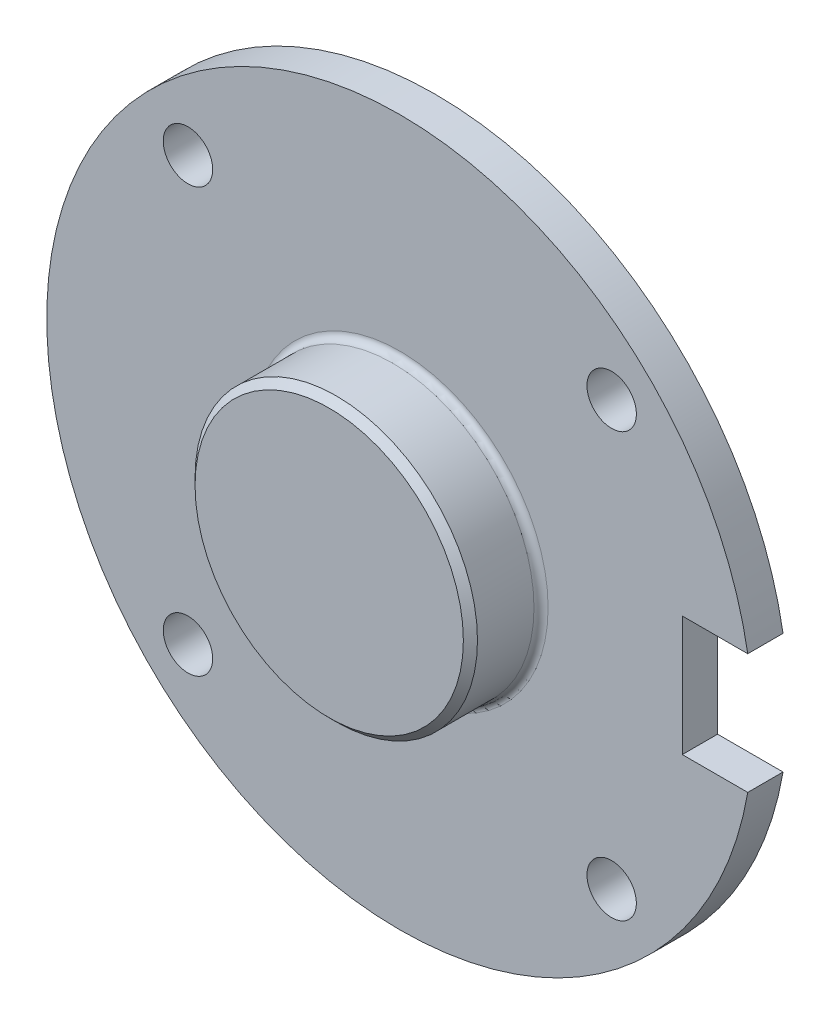
ISO-10303-21;
HEADER;
FILE_DESCRIPTION(('STEP AP214'),'2;1');
FILE_NAME('part.step','',(''),(''),'','','');
FILE_SCHEMA(('AUTOMOTIVE_DESIGN { 1 0 10303 214 1 1 1 1 }'));
ENDSEC;
DATA;
#1=APPLICATION_CONTEXT('core data for automotive mechanical design processes');
#2=APPLICATION_PROTOCOL_DEFINITION('international standard','automotive_design',2000,#1);
#3=PRODUCT_CONTEXT('',#1,'mechanical');
#4=PRODUCT('Part','Part','',(#3));
#5=PRODUCT_RELATED_PRODUCT_CATEGORY('part','',(#4));
#6=PRODUCT_DEFINITION_FORMATION('','',#4);
#7=PRODUCT_DEFINITION_CONTEXT('part definition',#1,'design');
#8=PRODUCT_DEFINITION('design','',#6,#7);
#9=PRODUCT_DEFINITION_SHAPE('','',#8);
#10=(LENGTH_UNIT() NAMED_UNIT(*) SI_UNIT(.MILLI.,.METRE.));
#11=(NAMED_UNIT(*) PLANE_ANGLE_UNIT() SI_UNIT($,.RADIAN.));
#12=(NAMED_UNIT(*) SI_UNIT($,.STERADIAN.) SOLID_ANGLE_UNIT());
#13=UNCERTAINTY_MEASURE_WITH_UNIT(LENGTH_MEASURE(1.E-05),#10,'distance_accuracy_value','');
#14=(GEOMETRIC_REPRESENTATION_CONTEXT(3) GLOBAL_UNCERTAINTY_ASSIGNED_CONTEXT((#13)) GLOBAL_UNIT_ASSIGNED_CONTEXT((#10,
#11,#12)) REPRESENTATION_CONTEXT('',''));
#15=CARTESIAN_POINT('',(0.,0.,0.));
#16=DIRECTION('',(0.,0.,1.));
#17=DIRECTION('',(1.,0.,0.));
#18=AXIS2_PLACEMENT_3D('',#15,#16,#17);
#19=CARTESIAN_POINT('',(0.,0.,50.));
#20=DIRECTION('',(0.,0.,1.));
#21=DIRECTION('',(1.,0.,0.));
#22=AXIS2_PLACEMENT_3D('',#19,#20,#21);
#23=CYLINDRICAL_SURFACE('',#22,50.);
#24=CARTESIAN_POINT('',(0.,0.,5.));
#25=DIRECTION('',(0.,0.,1.));
#26=DIRECTION('',(1.,0.,0.));
#27=AXIS2_PLACEMENT_3D('',#24,#25,#26);
#28=CIRCLE('',#27,50.);
#29=CARTESIAN_POINT('',(49.2722031169705,8.5,5.));
#30=VERTEX_POINT('',#29);
#31=CARTESIAN_POINT('',(49.2722031169705,-8.5,5.));
#32=VERTEX_POINT('',#31);
#33=EDGE_CURVE('E126',#30,#32,#28,.T.);
#34=ORIENTED_EDGE('',*,*,#33,.F.);
#35=DIRECTION('',(0.,0.,1.));
#36=VECTOR('',#35,1.);
#37=CARTESIAN_POINT('',(49.2722031169705,8.5,50.));
#38=LINE('',#37,#36);
#39=CARTESIAN_POINT('',(49.2722031169705,8.5,0.));
#40=VERTEX_POINT('',#39);
#41=EDGE_CURVE('E112',#30,#40,#38,.F.);
#42=ORIENTED_EDGE('',*,*,#41,.T.);
#43=CARTESIAN_POINT('',(0.,0.,0.));
#44=DIRECTION('',(0.,0.,1.));
#45=DIRECTION('',(1.,0.,0.));
#46=AXIS2_PLACEMENT_3D('',#43,#44,#45);
#47=CIRCLE('',#46,50.);
#48=CARTESIAN_POINT('',(49.2722031169705,-8.5,0.));
#49=VERTEX_POINT('',#48);
#50=EDGE_CURVE('E51',#40,#49,#47,.T.);
#51=ORIENTED_EDGE('',*,*,#50,.T.);
#52=DIRECTION('',(0.,0.,1.));
#53=VECTOR('',#52,1.);
#54=CARTESIAN_POINT('',(49.2722031169705,-8.5,50.));
#55=LINE('',#54,#53);
#56=EDGE_CURVE('E96',#49,#32,#55,.T.);
#57=ORIENTED_EDGE('',*,*,#56,.T.);
#58=EDGE_LOOP('',(#34,#42,#51,#57));
#59=FACE_BOUND('',#58,.T.);
#60=ADVANCED_FACE('F43',(#59),#23,.T.);
#61=CARTESIAN_POINT('',(0.,50.,0.));
#62=DIRECTION('',(0.,0.,1.));
#63=DIRECTION('',(1.,0.,0.));
#64=AXIS2_PLACEMENT_3D('',#61,#62,#63);
#65=PLANE('',#64);
#66=CARTESIAN_POINT('',(29.9999999999997,30.0000000000003,0.));
#67=DIRECTION('',(0.,0.,1.));
#68=DIRECTION('',(1.,0.,0.));
#69=AXIS2_PLACEMENT_3D('',#66,#67,#68);
#70=CIRCLE('',#69,3.5);
#71=CARTESIAN_POINT('',(33.4999999999997,30.0000000000003,0.));
#72=VERTEX_POINT('',#71);
#73=EDGE_CURVE('E231',#72,#72,#70,.T.);
#74=ORIENTED_EDGE('',*,*,#73,.T.);
#75=EDGE_LOOP('',(#74));
#76=FACE_BOUND('',#75,.T.);
#77=CARTESIAN_POINT('',(30.0000000000002,-29.9999999999998,0.));
#78=DIRECTION('',(0.,0.,1.));
#79=DIRECTION('',(1.,0.,0.));
#80=AXIS2_PLACEMENT_3D('',#77,#78,#79);
#81=CIRCLE('',#80,3.5);
#82=CARTESIAN_POINT('',(33.5000000000002,-29.9999999999998,0.));
#83=VERTEX_POINT('',#82);
#84=EDGE_CURVE('E235',#83,#83,#81,.T.);
#85=ORIENTED_EDGE('',*,*,#84,.T.);
#86=EDGE_LOOP('',(#85));
#87=FACE_BOUND('',#86,.T.);
#88=CARTESIAN_POINT('',(-29.9999999999999,-30.0000000000001,0.));
#89=DIRECTION('',(0.,0.,1.));
#90=DIRECTION('',(1.,0.,0.));
#91=AXIS2_PLACEMENT_3D('',#88,#89,#90);
#92=CIRCLE('',#91,3.5);
#93=CARTESIAN_POINT('',(-26.4999999999999,-30.0000000000001,0.));
#94=VERTEX_POINT('',#93);
#95=EDGE_CURVE('E244',#94,#94,#92,.T.);
#96=ORIENTED_EDGE('',*,*,#95,.T.);
#97=EDGE_LOOP('',(#96));
#98=FACE_BOUND('',#97,.T.);
#99=CARTESIAN_POINT('',(-30.,30.,0.));
#100=DIRECTION('',(0.,0.,1.));
#101=DIRECTION('',(1.,0.,0.));
#102=AXIS2_PLACEMENT_3D('',#99,#100,#101);
#103=CIRCLE('',#102,3.5);
#104=CARTESIAN_POINT('',(-26.5,30.,0.));
#105=VERTEX_POINT('',#104);
#106=EDGE_CURVE('E105',#105,#105,#103,.T.);
#107=ORIENTED_EDGE('',*,*,#106,.T.);
#108=EDGE_LOOP('',(#107));
#109=FACE_BOUND('',#108,.T.);
#110=ORIENTED_EDGE('',*,*,#50,.F.);
#111=DIRECTION('',(-1.,0.,0.));
#112=VECTOR('',#111,1.);
#113=CARTESIAN_POINT('',(40.,8.5,0.));
#114=LINE('',#113,#112);
#115=CARTESIAN_POINT('',(40.,8.5,0.));
#116=VERTEX_POINT('',#115);
#117=EDGE_CURVE('E66',#40,#116,#114,.T.);
#118=ORIENTED_EDGE('',*,*,#117,.T.);
#119=DIRECTION('',(0.,-1.,0.));
#120=VECTOR('',#119,1.);
#121=CARTESIAN_POINT('',(40.,-8.5,0.));
#122=LINE('',#121,#120);
#123=CARTESIAN_POINT('',(40.,-8.5,0.));
#124=VERTEX_POINT('',#123);
#125=EDGE_CURVE('E87',#116,#124,#122,.T.);
#126=ORIENTED_EDGE('',*,*,#125,.T.);
#127=DIRECTION('',(1.,0.,0.));
#128=VECTOR('',#127,1.);
#129=CARTESIAN_POINT('',(40.,-8.5,0.));
#130=LINE('',#129,#128);
#131=EDGE_CURVE('E93',#124,#49,#130,.T.);
#132=ORIENTED_EDGE('',*,*,#131,.T.);
#133=EDGE_LOOP('',(#110,#118,#126,#132));
#134=FACE_BOUND('',#133,.T.);
#135=ADVANCED_FACE('F45',(#76,#87,#98,#109,#134),#65,.F.);
#136=CARTESIAN_POINT('',(0.,21.,5.));
#137=DIRECTION('',(0.,0.,-1.));
#138=DIRECTION('',(-1.,0.,0.));
#139=AXIS2_PLACEMENT_3D('',#136,#137,#138);
#140=PLANE('',#139);
#141=CARTESIAN_POINT('',(29.9999999999997,30.0000000000003,5.));
#142=DIRECTION('',(0.,0.,1.));
#143=DIRECTION('',(1.,0.,0.));
#144=AXIS2_PLACEMENT_3D('',#141,#142,#143);
#145=CIRCLE('',#144,3.5);
#146=CARTESIAN_POINT('',(33.4999999999997,30.0000000000003,5.));
#147=VERTEX_POINT('',#146);
#148=EDGE_CURVE('E228',#147,#147,#145,.T.);
#149=ORIENTED_EDGE('',*,*,#148,.F.);
#150=EDGE_LOOP('',(#149));
#151=FACE_BOUND('',#150,.T.);
#152=CARTESIAN_POINT('',(30.0000000000002,-29.9999999999998,5.));
#153=DIRECTION('',(0.,0.,1.));
#154=DIRECTION('',(1.,0.,0.));
#155=AXIS2_PLACEMENT_3D('',#152,#153,#154);
#156=CIRCLE('',#155,3.5);
#157=CARTESIAN_POINT('',(33.5000000000002,-29.9999999999998,5.));
#158=VERTEX_POINT('',#157);
#159=EDGE_CURVE('E232',#158,#158,#156,.T.);
#160=ORIENTED_EDGE('',*,*,#159,.F.);
#161=EDGE_LOOP('',(#160));
#162=FACE_BOUND('',#161,.T.);
#163=CARTESIAN_POINT('',(-29.9999999999999,-30.0000000000001,5.));
#164=DIRECTION('',(0.,0.,1.));
#165=DIRECTION('',(1.,0.,0.));
#166=AXIS2_PLACEMENT_3D('',#163,#164,#165);
#167=CIRCLE('',#166,3.5);
#168=CARTESIAN_POINT('',(-26.4999999999999,-30.0000000000001,5.));
#169=VERTEX_POINT('',#168);
#170=EDGE_CURVE('E241',#169,#169,#167,.T.);
#171=ORIENTED_EDGE('',*,*,#170,.F.);
#172=EDGE_LOOP('',(#171));
#173=FACE_BOUND('',#172,.T.);
#174=CARTESIAN_POINT('',(-30.,30.,5.));
#175=DIRECTION('',(0.,0.,1.));
#176=DIRECTION('',(1.,0.,0.));
#177=AXIS2_PLACEMENT_3D('',#174,#175,#176);
#178=CIRCLE('',#177,3.5);
#179=CARTESIAN_POINT('',(-26.5,30.,5.));
#180=VERTEX_POINT('',#179);
#181=EDGE_CURVE('E246',#180,#180,#178,.T.);
#182=ORIENTED_EDGE('',*,*,#181,.F.);
#183=EDGE_LOOP('',(#182));
#184=FACE_BOUND('',#183,.T.);
#185=CARTESIAN_POINT('',(0.,0.,5.));
#186=DIRECTION('',(0.,0.,1.));
#187=DIRECTION('',(1.,0.,0.));
#188=AXIS2_PLACEMENT_3D('',#185,#186,#187);
#189=CIRCLE('',#188,21.);
#190=CARTESIAN_POINT('',(21.,0.,5.));
#191=VERTEX_POINT('',#190);
#192=EDGE_CURVE('E123',#191,#191,#189,.T.);
#193=ORIENTED_EDGE('',*,*,#192,.F.);
#194=EDGE_LOOP('',(#193));
#195=FACE_BOUND('',#194,.T.);
#196=DIRECTION('',(0.,-1.,0.));
#197=VECTOR('',#196,1.);
#198=CARTESIAN_POINT('',(40.,-8.5,5.));
#199=LINE('',#198,#197);
#200=CARTESIAN_POINT('',(40.,8.5,5.));
#201=VERTEX_POINT('',#200);
#202=CARTESIAN_POINT('',(40.,-8.5,5.));
#203=VERTEX_POINT('',#202);
#204=EDGE_CURVE('E58',#201,#203,#199,.T.);
#205=ORIENTED_EDGE('',*,*,#204,.F.);
#206=DIRECTION('',(1.,0.,0.));
#207=VECTOR('',#206,1.);
#208=CARTESIAN_POINT('',(0.,8.5,5.));
#209=LINE('',#208,#207);
#210=EDGE_CURVE('E11',#201,#30,#209,.T.);
#211=ORIENTED_EDGE('',*,*,#210,.T.);
#212=ORIENTED_EDGE('',*,*,#33,.T.);
#213=DIRECTION('',(1.,0.,0.));
#214=VECTOR('',#213,1.);
#215=CARTESIAN_POINT('',(40.,-8.5,5.));
#216=LINE('',#215,#214);
#217=EDGE_CURVE('E101',#203,#32,#216,.T.);
#218=ORIENTED_EDGE('',*,*,#217,.F.);
#219=EDGE_LOOP('',(#205,#211,#212,#218));
#220=FACE_BOUND('',#219,.T.);
#221=ADVANCED_FACE('F132',(#151,#162,#173,#184,#195,#220),#140,.F.);
#222=CARTESIAN_POINT('',(0.,0.,6.));
#223=DIRECTION('',(0.,0.,1.));
#224=DIRECTION('',(1.,0.,0.));
#225=AXIS2_PLACEMENT_3D('',#222,#223,#224);
#226=TOROIDAL_SURFACE('',#225,21.,0.999999999999999);
#227=CARTESIAN_POINT('',(0.,0.,6.));
#228=DIRECTION('',(0.,0.,1.));
#229=DIRECTION('',(1.,0.,0.));
#230=AXIS2_PLACEMENT_3D('',#227,#228,#229);
#231=CIRCLE('',#230,20.);
#232=CARTESIAN_POINT('',(20.,0.,6.));
#233=VERTEX_POINT('',#232);
#234=EDGE_CURVE('E120',#233,#233,#231,.T.);
#235=ORIENTED_EDGE('',*,*,#234,.F.);
#236=EDGE_LOOP('',(#235));
#237=FACE_BOUND('',#236,.T.);
#238=ORIENTED_EDGE('',*,*,#192,.T.);
#239=EDGE_LOOP('',(#238));
#240=FACE_BOUND('',#239,.T.);
#241=ADVANCED_FACE('F134',(#237,#240),#226,.F.);
#242=CARTESIAN_POINT('',(0.,0.,50.));
#243=DIRECTION('',(0.,0.,1.));
#244=DIRECTION('',(1.,0.,0.));
#245=AXIS2_PLACEMENT_3D('',#242,#243,#244);
#246=CYLINDRICAL_SURFACE('',#245,20.);
#247=CARTESIAN_POINT('',(0.,0.,14.));
#248=DIRECTION('',(0.,0.,1.));
#249=DIRECTION('',(1.,0.,0.));
#250=AXIS2_PLACEMENT_3D('',#247,#248,#249);
#251=CIRCLE('',#250,20.);
#252=CARTESIAN_POINT('',(20.,0.,14.));
#253=VERTEX_POINT('',#252);
#254=EDGE_CURVE('E117',#253,#253,#251,.T.);
#255=ORIENTED_EDGE('',*,*,#254,.F.);
#256=EDGE_LOOP('',(#255));
#257=FACE_BOUND('',#256,.T.);
#258=ORIENTED_EDGE('',*,*,#234,.T.);
#259=EDGE_LOOP('',(#258));
#260=FACE_BOUND('',#259,.T.);
#261=ADVANCED_FACE('F142',(#257,#260),#246,.T.);
#262=CARTESIAN_POINT('',(0.,0.,14.));
#263=DIRECTION('',(0.,0.,-1.));
#264=DIRECTION('',(-1.,0.,0.));
#265=AXIS2_PLACEMENT_3D('',#262,#263,#264);
#266=CONICAL_SURFACE('',#265,20.,0.785398163397448);
#267=CARTESIAN_POINT('',(0.,0.,15.));
#268=DIRECTION('',(0.,0.,1.));
#269=DIRECTION('',(1.,0.,0.));
#270=AXIS2_PLACEMENT_3D('',#267,#268,#269);
#271=CIRCLE('',#270,19.);
#272=CARTESIAN_POINT('',(19.,0.,15.));
#273=VERTEX_POINT('',#272);
#274=EDGE_CURVE('E114',#273,#273,#271,.T.);
#275=ORIENTED_EDGE('',*,*,#274,.F.);
#276=EDGE_LOOP('',(#275));
#277=FACE_BOUND('',#276,.T.);
#278=ORIENTED_EDGE('',*,*,#254,.T.);
#279=EDGE_LOOP('',(#278));
#280=FACE_BOUND('',#279,.T.);
#281=ADVANCED_FACE('F201',(#277,#280),#266,.T.);
#282=CARTESIAN_POINT('',(0.,0.,15.));
#283=DIRECTION('',(0.,0.,-1.));
#284=DIRECTION('',(-1.,0.,0.));
#285=AXIS2_PLACEMENT_3D('',#282,#283,#284);
#286=PLANE('',#285);
#287=ORIENTED_EDGE('',*,*,#274,.T.);
#288=EDGE_LOOP('',(#287));
#289=FACE_BOUND('',#288,.T.);
#290=ADVANCED_FACE('F157',(#289),#286,.F.);
#291=CARTESIAN_POINT('',(40.,8.5,0.));
#292=DIRECTION('',(0.,1.,0.));
#293=DIRECTION('',(0.,0.,1.));
#294=AXIS2_PLACEMENT_3D('',#291,#292,#293);
#295=PLANE('',#294);
#296=ORIENTED_EDGE('',*,*,#210,.F.);
#297=DIRECTION('',(0.,0.,1.));
#298=VECTOR('',#297,1.);
#299=CARTESIAN_POINT('',(40.,8.5,0.));
#300=LINE('',#299,#298);
#301=EDGE_CURVE('E90',#116,#201,#300,.T.);
#302=ORIENTED_EDGE('',*,*,#301,.F.);
#303=ORIENTED_EDGE('',*,*,#117,.F.);
#304=ORIENTED_EDGE('',*,*,#41,.F.);
#305=EDGE_LOOP('',(#296,#302,#303,#304));
#306=FACE_BOUND('',#305,.T.);
#307=ADVANCED_FACE('F130',(#306),#295,.F.);
#308=CARTESIAN_POINT('',(40.,-8.5,0.));
#309=DIRECTION('',(0.,-1.,0.));
#310=DIRECTION('',(0.,0.,-1.));
#311=AXIS2_PLACEMENT_3D('',#308,#309,#310);
#312=PLANE('',#311);
#313=ORIENTED_EDGE('',*,*,#131,.F.);
#314=DIRECTION('',(0.,0.,1.));
#315=VECTOR('',#314,1.);
#316=CARTESIAN_POINT('',(40.,-8.5,0.));
#317=LINE('',#316,#315);
#318=EDGE_CURVE('E83',#124,#203,#317,.T.);
#319=ORIENTED_EDGE('',*,*,#318,.T.);
#320=ORIENTED_EDGE('',*,*,#217,.T.);
#321=ORIENTED_EDGE('',*,*,#56,.F.);
#322=EDGE_LOOP('',(#313,#319,#320,#321));
#323=FACE_BOUND('',#322,.T.);
#324=ADVANCED_FACE('F94',(#323),#312,.F.);
#325=CARTESIAN_POINT('',(40.,-8.5,0.));
#326=DIRECTION('',(-1.,0.,0.));
#327=DIRECTION('',(0.,0.,1.));
#328=AXIS2_PLACEMENT_3D('',#325,#326,#327);
#329=PLANE('',#328);
#330=ORIENTED_EDGE('',*,*,#204,.T.);
#331=ORIENTED_EDGE('',*,*,#318,.F.);
#332=ORIENTED_EDGE('',*,*,#125,.F.);
#333=ORIENTED_EDGE('',*,*,#301,.T.);
#334=EDGE_LOOP('',(#330,#331,#332,#333));
#335=FACE_BOUND('',#334,.T.);
#336=ADVANCED_FACE('F85',(#335),#329,.F.);
#337=CARTESIAN_POINT('',(-30.,30.,5.));
#338=DIRECTION('',(0.,0.,1.));
#339=DIRECTION('',(1.,0.,0.));
#340=AXIS2_PLACEMENT_3D('',#337,#338,#339);
#341=CYLINDRICAL_SURFACE('',#340,3.5);
#342=ORIENTED_EDGE('',*,*,#181,.T.);
#343=EDGE_LOOP('',(#342));
#344=FACE_BOUND('',#343,.T.);
#345=ORIENTED_EDGE('',*,*,#106,.F.);
#346=EDGE_LOOP('',(#345));
#347=FACE_BOUND('',#346,.T.);
#348=ADVANCED_FACE('F174',(#344,#347),#341,.F.);
#349=CARTESIAN_POINT('',(-29.9999999999999,-30.0000000000001,5.));
#350=DIRECTION('',(0.,0.,1.));
#351=DIRECTION('',(1.,0.,0.));
#352=AXIS2_PLACEMENT_3D('',#349,#350,#351);
#353=CYLINDRICAL_SURFACE('',#352,3.5);
#354=ORIENTED_EDGE('',*,*,#170,.T.);
#355=EDGE_LOOP('',(#354));
#356=FACE_BOUND('',#355,.T.);
#357=ORIENTED_EDGE('',*,*,#95,.F.);
#358=EDGE_LOOP('',(#357));
#359=FACE_BOUND('',#358,.T.);
#360=ADVANCED_FACE('F180',(#356,#359),#353,.F.);
#361=CARTESIAN_POINT('',(30.0000000000002,-29.9999999999998,5.));
#362=DIRECTION('',(0.,0.,1.));
#363=DIRECTION('',(1.,0.,0.));
#364=AXIS2_PLACEMENT_3D('',#361,#362,#363);
#365=CYLINDRICAL_SURFACE('',#364,3.5);
#366=ORIENTED_EDGE('',*,*,#159,.T.);
#367=EDGE_LOOP('',(#366));
#368=FACE_BOUND('',#367,.T.);
#369=ORIENTED_EDGE('',*,*,#84,.F.);
#370=EDGE_LOOP('',(#369));
#371=FACE_BOUND('',#370,.T.);
#372=ADVANCED_FACE('F216',(#368,#371),#365,.F.);
#373=CARTESIAN_POINT('',(29.9999999999997,30.0000000000003,5.));
#374=DIRECTION('',(0.,0.,1.));
#375=DIRECTION('',(1.,0.,0.));
#376=AXIS2_PLACEMENT_3D('',#373,#374,#375);
#377=CYLINDRICAL_SURFACE('',#376,3.5);
#378=ORIENTED_EDGE('',*,*,#148,.T.);
#379=EDGE_LOOP('',(#378));
#380=FACE_BOUND('',#379,.T.);
#381=ORIENTED_EDGE('',*,*,#73,.F.);
#382=EDGE_LOOP('',(#381));
#383=FACE_BOUND('',#382,.T.);
#384=ADVANCED_FACE('F220',(#380,#383),#377,.F.);
#385=CLOSED_SHELL('',(#60,#135,#221,#241,#261,#281,#290,#307,#324,#336,#348,#360,#372,#384));
#386=MANIFOLD_SOLID_BREP('B2',#385);
#387=ADVANCED_BREP_SHAPE_REPRESENTATION('',(#18,#386),#14);
#388=SHAPE_DEFINITION_REPRESENTATION(#9,#387);
ENDSEC;
END-ISO-10303-21;
